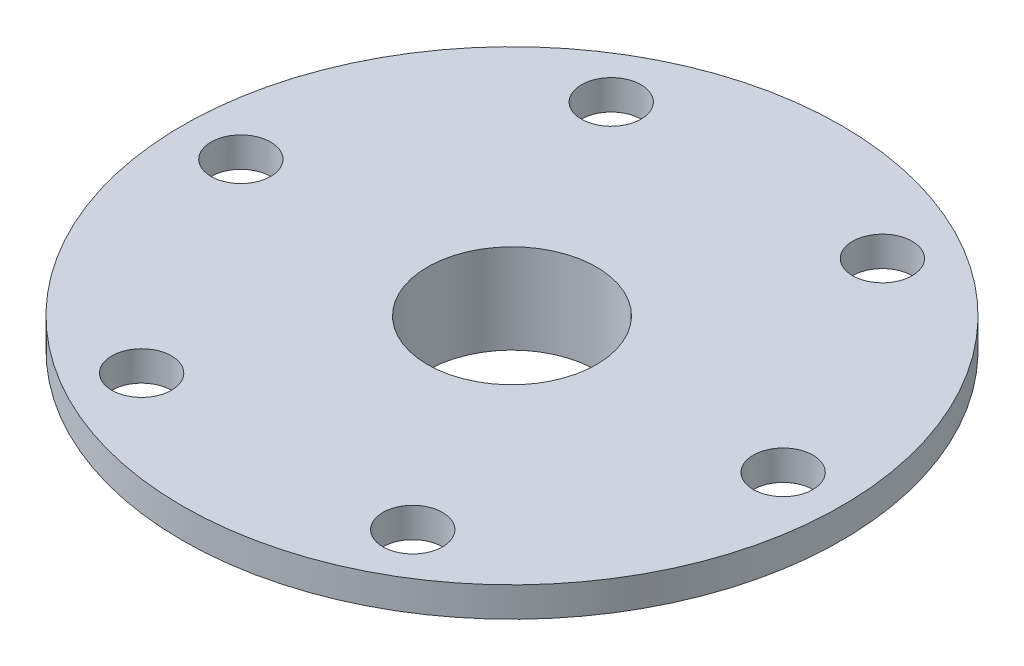
ISO-10303-21;
HEADER;
FILE_DESCRIPTION(('STEP AP214'),'2;1');
FILE_NAME('part.step','',(''),(''),'','','');
FILE_SCHEMA(('AUTOMOTIVE_DESIGN { 1 0 10303 214 1 1 1 1 }'));
ENDSEC;
DATA;
#1=APPLICATION_CONTEXT('core data for automotive mechanical design processes');
#2=APPLICATION_PROTOCOL_DEFINITION('international standard','automotive_design',2000,#1);
#3=PRODUCT_CONTEXT('',#1,'mechanical');
#4=PRODUCT('Part','Part','',(#3));
#5=PRODUCT_RELATED_PRODUCT_CATEGORY('part','',(#4));
#6=PRODUCT_DEFINITION_FORMATION('','',#4);
#7=PRODUCT_DEFINITION_CONTEXT('part definition',#1,'design');
#8=PRODUCT_DEFINITION('design','',#6,#7);
#9=PRODUCT_DEFINITION_SHAPE('','',#8);
#10=(LENGTH_UNIT() NAMED_UNIT(*) SI_UNIT(.MILLI.,.METRE.));
#11=(NAMED_UNIT(*) PLANE_ANGLE_UNIT() SI_UNIT($,.RADIAN.));
#12=(NAMED_UNIT(*) SI_UNIT($,.STERADIAN.) SOLID_ANGLE_UNIT());
#13=UNCERTAINTY_MEASURE_WITH_UNIT(LENGTH_MEASURE(1.E-05),#10,'distance_accuracy_value','');
#14=(GEOMETRIC_REPRESENTATION_CONTEXT(3) GLOBAL_UNCERTAINTY_ASSIGNED_CONTEXT((#13)) GLOBAL_UNIT_ASSIGNED_CONTEXT((#10,
#11,#12)) REPRESENTATION_CONTEXT('',''));
#15=CARTESIAN_POINT('',(0.,0.,0.));
#16=DIRECTION('',(0.,0.,1.));
#17=DIRECTION('',(1.,0.,0.));
#18=AXIS2_PLACEMENT_3D('',#15,#16,#17);
#19=CARTESIAN_POINT('',(0.,27.2792430533376,0.));
#20=DIRECTION('',(0.,1.,0.));
#21=DIRECTION('',(0.,0.,1.));
#22=AXIS2_PLACEMENT_3D('',#19,#20,#21);
#23=CYLINDRICAL_SURFACE('',#22,8.5);
#24=CARTESIAN_POINT('',(0.,0.,0.));
#25=DIRECTION('',(0.,1.,0.));
#26=DIRECTION('',(0.,0.,1.));
#27=AXIS2_PLACEMENT_3D('',#24,#25,#26);
#28=CIRCLE('',#27,8.5);
#29=CARTESIAN_POINT('',(0.,0.,8.5));
#30=VERTEX_POINT('',#29);
#31=EDGE_CURVE('E10',#30,#30,#28,.T.);
#32=ORIENTED_EDGE('',*,*,#31,.T.);
#33=EDGE_LOOP('',(#32));
#34=FACE_BOUND('',#33,.T.);
#35=CARTESIAN_POINT('',(0.,-9.00000000000001,0.));
#36=DIRECTION('',(0.,1.,0.));
#37=DIRECTION('',(0.,0.,1.));
#38=AXIS2_PLACEMENT_3D('',#35,#36,#37);
#39=CIRCLE('',#38,8.5);
#40=CARTESIAN_POINT('',(0.,-9.00000000000001,8.5));
#41=VERTEX_POINT('',#40);
#42=EDGE_CURVE('E68',#41,#41,#39,.T.);
#43=ORIENTED_EDGE('',*,*,#42,.F.);
#44=EDGE_LOOP('',(#43));
#45=FACE_BOUND('',#44,.T.);
#46=ADVANCED_FACE('F35',(#34,#45),#23,.F.);
#47=CARTESIAN_POINT('',(-8.5,0.,0.));
#48=DIRECTION('',(0.,1.,0.));
#49=DIRECTION('',(0.,0.,1.));
#50=AXIS2_PLACEMENT_3D('',#47,#48,#49);
#51=PLANE('',#50);
#52=CARTESIAN_POINT('',(-27.26875,0.,0.));
#53=DIRECTION('',(0.,1.,0.));
#54=DIRECTION('',(0.,0.,1.));
#55=AXIS2_PLACEMENT_3D('',#52,#53,#54);
#56=CIRCLE('',#55,3.);
#57=CARTESIAN_POINT('',(-27.26875,0.,3.));
#58=VERTEX_POINT('',#57);
#59=EDGE_CURVE('E55',#58,#58,#56,.T.);
#60=ORIENTED_EDGE('',*,*,#59,.F.);
#61=EDGE_LOOP('',(#60));
#62=FACE_BOUND('',#61,.T.);
#63=CARTESIAN_POINT('',(-13.634375,0.,23.6154302294469));
#64=DIRECTION('',(0.,1.,0.));
#65=DIRECTION('',(0.,0.,1.));
#66=AXIS2_PLACEMENT_3D('',#63,#64,#65);
#67=CIRCLE('',#66,3.);
#68=CARTESIAN_POINT('',(-13.634375,0.,26.6154302294469));
#69=VERTEX_POINT('',#68);
#70=EDGE_CURVE('E119',#69,#69,#67,.T.);
#71=ORIENTED_EDGE('',*,*,#70,.F.);
#72=EDGE_LOOP('',(#71));
#73=FACE_BOUND('',#72,.T.);
#74=CARTESIAN_POINT('',(13.634375,0.,23.6154302294469));
#75=DIRECTION('',(0.,1.,0.));
#76=DIRECTION('',(0.,0.,1.));
#77=AXIS2_PLACEMENT_3D('',#74,#75,#76);
#78=CIRCLE('',#77,2.99999999999999);
#79=CARTESIAN_POINT('',(13.634375,0.,26.6154302294469));
#80=VERTEX_POINT('',#79);
#81=EDGE_CURVE('E80',#80,#80,#78,.T.);
#82=ORIENTED_EDGE('',*,*,#81,.F.);
#83=EDGE_LOOP('',(#82));
#84=FACE_BOUND('',#83,.T.);
#85=CARTESIAN_POINT('',(27.26875,0.,0.));
#86=DIRECTION('',(0.,1.,0.));
#87=DIRECTION('',(0.,0.,1.));
#88=AXIS2_PLACEMENT_3D('',#85,#86,#87);
#89=CIRCLE('',#88,3.);
#90=CARTESIAN_POINT('',(27.26875,0.,3.));
#91=VERTEX_POINT('',#90);
#92=EDGE_CURVE('E126',#91,#91,#89,.T.);
#93=ORIENTED_EDGE('',*,*,#92,.F.);
#94=EDGE_LOOP('',(#93));
#95=FACE_BOUND('',#94,.T.);
#96=CARTESIAN_POINT('',(13.634375,0.,-23.6154302294469));
#97=DIRECTION('',(0.,1.,0.));
#98=DIRECTION('',(0.,0.,1.));
#99=AXIS2_PLACEMENT_3D('',#96,#97,#98);
#100=CIRCLE('',#99,3.);
#101=CARTESIAN_POINT('',(13.634375,0.,-20.6154302294469));
#102=VERTEX_POINT('',#101);
#103=EDGE_CURVE('E130',#102,#102,#100,.T.);
#104=ORIENTED_EDGE('',*,*,#103,.F.);
#105=EDGE_LOOP('',(#104));
#106=FACE_BOUND('',#105,.T.);
#107=CARTESIAN_POINT('',(-13.634375,0.,-23.6154302294469));
#108=DIRECTION('',(0.,1.,0.));
#109=DIRECTION('',(0.,0.,1.));
#110=AXIS2_PLACEMENT_3D('',#107,#108,#109);
#111=CIRCLE('',#110,3.);
#112=CARTESIAN_POINT('',(-13.634375,0.,-20.6154302294469));
#113=VERTEX_POINT('',#112);
#114=EDGE_CURVE('E134',#113,#113,#111,.T.);
#115=ORIENTED_EDGE('',*,*,#114,.F.);
#116=EDGE_LOOP('',(#115));
#117=FACE_BOUND('',#116,.T.);
#118=CARTESIAN_POINT('',(0.,0.,0.));
#119=DIRECTION('',(0.,1.,0.));
#120=DIRECTION('',(0.,0.,1.));
#121=AXIS2_PLACEMENT_3D('',#118,#119,#120);
#122=CIRCLE('',#121,33.14375);
#123=CARTESIAN_POINT('',(0.,0.,33.14375));
#124=VERTEX_POINT('',#123);
#125=EDGE_CURVE('E42',#124,#124,#122,.T.);
#126=ORIENTED_EDGE('',*,*,#125,.T.);
#127=EDGE_LOOP('',(#126));
#128=FACE_BOUND('',#127,.T.);
#129=ORIENTED_EDGE('',*,*,#31,.F.);
#130=EDGE_LOOP('',(#129));
#131=FACE_BOUND('',#130,.T.);
#132=ADVANCED_FACE('F102',(#62,#73,#84,#95,#106,#117,#128,#131),#51,.T.);
#133=CARTESIAN_POINT('',(0.,27.2792430533376,0.));
#134=DIRECTION('',(0.,1.,0.));
#135=DIRECTION('',(0.,0.,1.));
#136=AXIS2_PLACEMENT_3D('',#133,#134,#135);
#137=CYLINDRICAL_SURFACE('',#136,33.14375);
#138=CARTESIAN_POINT('',(0.,-3.,0.));
#139=DIRECTION('',(0.,1.,0.));
#140=DIRECTION('',(0.,0.,1.));
#141=AXIS2_PLACEMENT_3D('',#138,#139,#140);
#142=CIRCLE('',#141,33.14375);
#143=CARTESIAN_POINT('',(0.,-3.,33.14375));
#144=VERTEX_POINT('',#143);
#145=EDGE_CURVE('E47',#144,#144,#142,.T.);
#146=ORIENTED_EDGE('',*,*,#145,.T.);
#147=EDGE_LOOP('',(#146));
#148=FACE_BOUND('',#147,.T.);
#149=ORIENTED_EDGE('',*,*,#125,.F.);
#150=EDGE_LOOP('',(#149));
#151=FACE_BOUND('',#150,.T.);
#152=ADVANCED_FACE('F87',(#148,#151),#137,.T.);
#153=CARTESIAN_POINT('',(-33.14375,-3.,0.));
#154=DIRECTION('',(0.,-1.,0.));
#155=DIRECTION('',(0.,0.,-1.));
#156=AXIS2_PLACEMENT_3D('',#153,#154,#155);
#157=PLANE('',#156);
#158=CARTESIAN_POINT('',(-27.26875,-3.,0.));
#159=DIRECTION('',(0.,-1.,0.));
#160=DIRECTION('',(0.,0.,-1.));
#161=AXIS2_PLACEMENT_3D('',#158,#159,#160);
#162=CIRCLE('',#161,3.);
#163=CARTESIAN_POINT('',(-27.26875,-3.,-3.));
#164=VERTEX_POINT('',#163);
#165=EDGE_CURVE('E38',#164,#164,#162,.T.);
#166=ORIENTED_EDGE('',*,*,#165,.F.);
#167=EDGE_LOOP('',(#166));
#168=FACE_BOUND('',#167,.T.);
#169=CARTESIAN_POINT('',(-13.634375,-3.,23.6154302294469));
#170=DIRECTION('',(0.,-1.,0.));
#171=DIRECTION('',(0.,0.,-1.));
#172=AXIS2_PLACEMENT_3D('',#169,#170,#171);
#173=CIRCLE('',#172,3.);
#174=CARTESIAN_POINT('',(-13.634375,-3.,20.6154302294469));
#175=VERTEX_POINT('',#174);
#176=EDGE_CURVE('E63',#175,#175,#173,.T.);
#177=ORIENTED_EDGE('',*,*,#176,.F.);
#178=EDGE_LOOP('',(#177));
#179=FACE_BOUND('',#178,.T.);
#180=CARTESIAN_POINT('',(13.634375,-3.,23.6154302294469));
#181=DIRECTION('',(0.,-1.,0.));
#182=DIRECTION('',(0.,0.,-1.));
#183=AXIS2_PLACEMENT_3D('',#180,#181,#182);
#184=CIRCLE('',#183,2.99999999999999);
#185=CARTESIAN_POINT('',(13.634375,-3.,20.6154302294469));
#186=VERTEX_POINT('',#185);
#187=EDGE_CURVE('E61',#186,#186,#184,.T.);
#188=ORIENTED_EDGE('',*,*,#187,.F.);
#189=EDGE_LOOP('',(#188));
#190=FACE_BOUND('',#189,.T.);
#191=CARTESIAN_POINT('',(27.26875,-3.,0.));
#192=DIRECTION('',(0.,-1.,0.));
#193=DIRECTION('',(0.,0.,-1.));
#194=AXIS2_PLACEMENT_3D('',#191,#192,#193);
#195=CIRCLE('',#194,3.);
#196=CARTESIAN_POINT('',(27.26875,-3.,-3.));
#197=VERTEX_POINT('',#196);
#198=EDGE_CURVE('E58',#197,#197,#195,.T.);
#199=ORIENTED_EDGE('',*,*,#198,.F.);
#200=EDGE_LOOP('',(#199));
#201=FACE_BOUND('',#200,.T.);
#202=CARTESIAN_POINT('',(13.634375,-3.,-23.6154302294469));
#203=DIRECTION('',(0.,-1.,0.));
#204=DIRECTION('',(0.,0.,-1.));
#205=AXIS2_PLACEMENT_3D('',#202,#203,#204);
#206=CIRCLE('',#205,3.);
#207=CARTESIAN_POINT('',(13.634375,-3.,-26.6154302294469));
#208=VERTEX_POINT('',#207);
#209=EDGE_CURVE('E54',#208,#208,#206,.T.);
#210=ORIENTED_EDGE('',*,*,#209,.F.);
#211=EDGE_LOOP('',(#210));
#212=FACE_BOUND('',#211,.T.);
#213=CARTESIAN_POINT('',(-13.634375,-3.,-23.6154302294469));
#214=DIRECTION('',(0.,-1.,0.));
#215=DIRECTION('',(0.,0.,-1.));
#216=AXIS2_PLACEMENT_3D('',#213,#214,#215);
#217=CIRCLE('',#216,3.);
#218=CARTESIAN_POINT('',(-13.634375,-3.,-26.6154302294469));
#219=VERTEX_POINT('',#218);
#220=EDGE_CURVE('E51',#219,#219,#217,.T.);
#221=ORIENTED_EDGE('',*,*,#220,.F.);
#222=EDGE_LOOP('',(#221));
#223=FACE_BOUND('',#222,.T.);
#224=CARTESIAN_POINT('',(0.,-3.,0.));
#225=DIRECTION('',(0.,1.,0.));
#226=DIRECTION('',(0.,0.,1.));
#227=AXIS2_PLACEMENT_3D('',#224,#225,#226);
#228=CIRCLE('',#227,12.25);
#229=CARTESIAN_POINT('',(0.,-3.,12.25));
#230=VERTEX_POINT('',#229);
#231=EDGE_CURVE('E77',#230,#230,#228,.T.);
#232=ORIENTED_EDGE('',*,*,#231,.T.);
#233=EDGE_LOOP('',(#232));
#234=FACE_BOUND('',#233,.T.);
#235=ORIENTED_EDGE('',*,*,#145,.F.);
#236=EDGE_LOOP('',(#235));
#237=FACE_BOUND('',#236,.T.);
#238=ADVANCED_FACE('F90',(#168,#179,#190,#201,#212,#223,#234,#237),#157,.T.);
#239=CARTESIAN_POINT('',(0.,27.2792430533376,0.));
#240=DIRECTION('',(0.,1.,0.));
#241=DIRECTION('',(0.,0.,1.));
#242=AXIS2_PLACEMENT_3D('',#239,#240,#241);
#243=CYLINDRICAL_SURFACE('',#242,12.25);
#244=CARTESIAN_POINT('',(0.,-9.,0.));
#245=DIRECTION('',(0.,1.,0.));
#246=DIRECTION('',(0.,0.,1.));
#247=AXIS2_PLACEMENT_3D('',#244,#245,#246);
#248=CIRCLE('',#247,12.25);
#249=CARTESIAN_POINT('',(0.,-9.,12.25));
#250=VERTEX_POINT('',#249);
#251=EDGE_CURVE('E72',#250,#250,#248,.T.);
#252=ORIENTED_EDGE('',*,*,#251,.T.);
#253=EDGE_LOOP('',(#252));
#254=FACE_BOUND('',#253,.T.);
#255=ORIENTED_EDGE('',*,*,#231,.F.);
#256=EDGE_LOOP('',(#255));
#257=FACE_BOUND('',#256,.T.);
#258=ADVANCED_FACE('F92',(#254,#257),#243,.T.);
#259=CARTESIAN_POINT('',(-12.25,-9.00000000000001,0.));
#260=DIRECTION('',(0.,-1.,0.));
#261=DIRECTION('',(0.,0.,-1.));
#262=AXIS2_PLACEMENT_3D('',#259,#260,#261);
#263=PLANE('',#262);
#264=ORIENTED_EDGE('',*,*,#42,.T.);
#265=EDGE_LOOP('',(#264));
#266=FACE_BOUND('',#265,.T.);
#267=ORIENTED_EDGE('',*,*,#251,.F.);
#268=EDGE_LOOP('',(#267));
#269=FACE_BOUND('',#268,.T.);
#270=ADVANCED_FACE('F99',(#266,#269),#263,.T.);
#271=CARTESIAN_POINT('',(-13.634375,-9.00000000000001,-23.6154302294469));
#272=DIRECTION('',(0.,1.,0.));
#273=DIRECTION('',(0.,0.,1.));
#274=AXIS2_PLACEMENT_3D('',#271,#272,#273);
#275=CYLINDRICAL_SURFACE('',#274,3.);
#276=ORIENTED_EDGE('',*,*,#220,.T.);
#277=EDGE_LOOP('',(#276));
#278=FACE_BOUND('',#277,.T.);
#279=ORIENTED_EDGE('',*,*,#114,.T.);
#280=EDGE_LOOP('',(#279));
#281=FACE_BOUND('',#280,.T.);
#282=ADVANCED_FACE('F159',(#278,#281),#275,.F.);
#283=CARTESIAN_POINT('',(13.634375,-9.00000000000001,-23.6154302294469));
#284=DIRECTION('',(0.,1.,0.));
#285=DIRECTION('',(0.,0.,1.));
#286=AXIS2_PLACEMENT_3D('',#283,#284,#285);
#287=CYLINDRICAL_SURFACE('',#286,3.);
#288=ORIENTED_EDGE('',*,*,#209,.T.);
#289=EDGE_LOOP('',(#288));
#290=FACE_BOUND('',#289,.T.);
#291=ORIENTED_EDGE('',*,*,#103,.T.);
#292=EDGE_LOOP('',(#291));
#293=FACE_BOUND('',#292,.T.);
#294=ADVANCED_FACE('F162',(#290,#293),#287,.F.);
#295=CARTESIAN_POINT('',(27.26875,-9.00000000000001,0.));
#296=DIRECTION('',(0.,1.,0.));
#297=DIRECTION('',(0.,0.,1.));
#298=AXIS2_PLACEMENT_3D('',#295,#296,#297);
#299=CYLINDRICAL_SURFACE('',#298,3.);
#300=ORIENTED_EDGE('',*,*,#198,.T.);
#301=EDGE_LOOP('',(#300));
#302=FACE_BOUND('',#301,.T.);
#303=ORIENTED_EDGE('',*,*,#92,.T.);
#304=EDGE_LOOP('',(#303));
#305=FACE_BOUND('',#304,.T.);
#306=ADVANCED_FACE('F155',(#302,#305),#299,.F.);
#307=CARTESIAN_POINT('',(13.634375,-9.00000000000001,23.6154302294469));
#308=DIRECTION('',(0.,1.,0.));
#309=DIRECTION('',(0.,0.,1.));
#310=AXIS2_PLACEMENT_3D('',#307,#308,#309);
#311=CYLINDRICAL_SURFACE('',#310,2.99999999999999);
#312=ORIENTED_EDGE('',*,*,#187,.T.);
#313=EDGE_LOOP('',(#312));
#314=FACE_BOUND('',#313,.T.);
#315=ORIENTED_EDGE('',*,*,#81,.T.);
#316=EDGE_LOOP('',(#315));
#317=FACE_BOUND('',#316,.T.);
#318=ADVANCED_FACE('F148',(#314,#317),#311,.F.);
#319=CARTESIAN_POINT('',(-13.634375,-9.00000000000001,23.6154302294469));
#320=DIRECTION('',(0.,1.,0.));
#321=DIRECTION('',(0.,0.,1.));
#322=AXIS2_PLACEMENT_3D('',#319,#320,#321);
#323=CYLINDRICAL_SURFACE('',#322,3.);
#324=ORIENTED_EDGE('',*,*,#176,.T.);
#325=EDGE_LOOP('',(#324));
#326=FACE_BOUND('',#325,.T.);
#327=ORIENTED_EDGE('',*,*,#70,.T.);
#328=EDGE_LOOP('',(#327));
#329=FACE_BOUND('',#328,.T.);
#330=ADVANCED_FACE('F145',(#326,#329),#323,.F.);
#331=CARTESIAN_POINT('',(-27.26875,-9.00000000000001,0.));
#332=DIRECTION('',(0.,1.,0.));
#333=DIRECTION('',(0.,0.,1.));
#334=AXIS2_PLACEMENT_3D('',#331,#332,#333);
#335=CYLINDRICAL_SURFACE('',#334,3.);
#336=ORIENTED_EDGE('',*,*,#165,.T.);
#337=EDGE_LOOP('',(#336));
#338=FACE_BOUND('',#337,.T.);
#339=ORIENTED_EDGE('',*,*,#59,.T.);
#340=EDGE_LOOP('',(#339));
#341=FACE_BOUND('',#340,.T.);
#342=ADVANCED_FACE('F147',(#338,#341),#335,.F.);
#343=CLOSED_SHELL('',(#46,#132,#152,#238,#258,#270,#282,#294,#306,#318,#330,#342));
#344=MANIFOLD_SOLID_BREP('B2',#343);
#345=ADVANCED_BREP_SHAPE_REPRESENTATION('',(#18,#344),#14);
#346=SHAPE_DEFINITION_REPRESENTATION(#9,#345);
ENDSEC;
END-ISO-10303-21;
